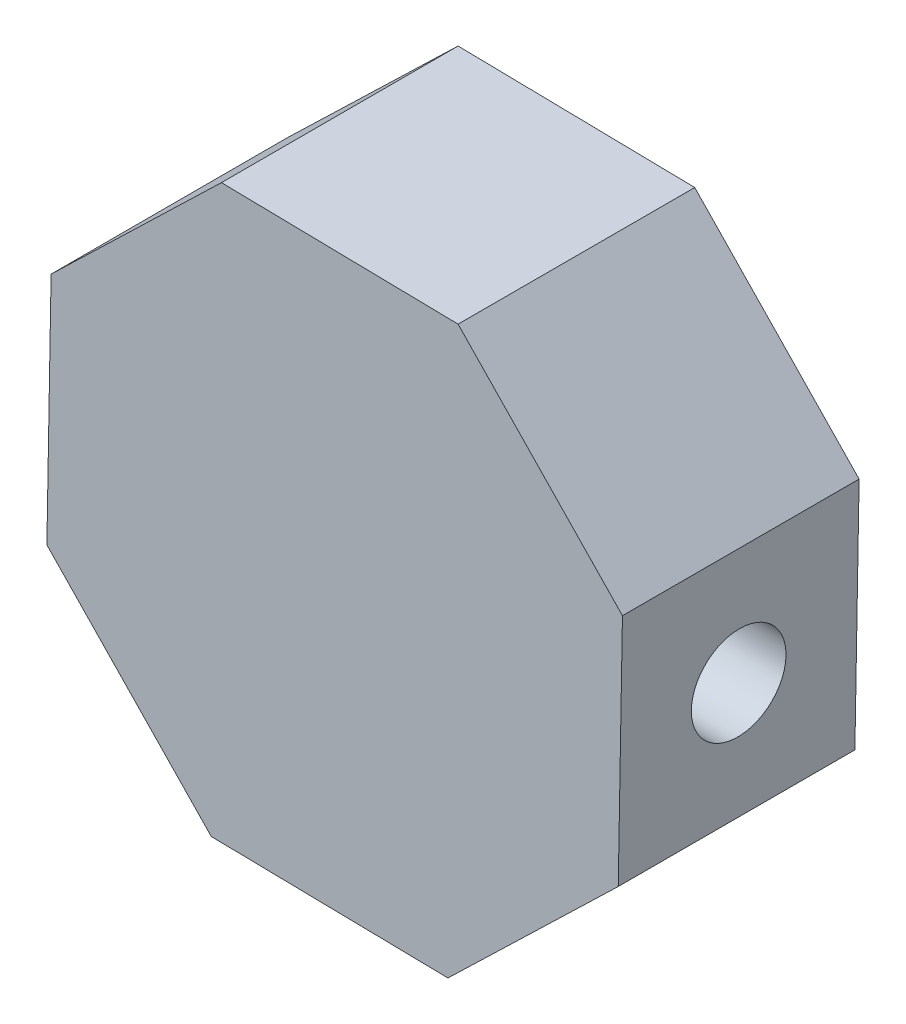
ISO-10303-21;
HEADER;
FILE_DESCRIPTION(('STEP AP214'),'2;1');
FILE_NAME('part.step','',(''),(''),'','','');
FILE_SCHEMA(('AUTOMOTIVE_DESIGN { 1 0 10303 214 1 1 1 1 }'));
ENDSEC;
DATA;
#1=APPLICATION_CONTEXT('core data for automotive mechanical design processes');
#2=APPLICATION_PROTOCOL_DEFINITION('international standard','automotive_design',2000,#1);
#3=PRODUCT_CONTEXT('',#1,'mechanical');
#4=PRODUCT('Part','Part','',(#3));
#5=PRODUCT_RELATED_PRODUCT_CATEGORY('part','',(#4));
#6=PRODUCT_DEFINITION_FORMATION('','',#4);
#7=PRODUCT_DEFINITION_CONTEXT('part definition',#1,'design');
#8=PRODUCT_DEFINITION('design','',#6,#7);
#9=PRODUCT_DEFINITION_SHAPE('','',#8);
#10=(LENGTH_UNIT() NAMED_UNIT(*) SI_UNIT(.MILLI.,.METRE.));
#11=(NAMED_UNIT(*) PLANE_ANGLE_UNIT() SI_UNIT($,.RADIAN.));
#12=(NAMED_UNIT(*) SI_UNIT($,.STERADIAN.) SOLID_ANGLE_UNIT());
#13=UNCERTAINTY_MEASURE_WITH_UNIT(LENGTH_MEASURE(1.E-05),#10,'distance_accuracy_value','');
#14=(GEOMETRIC_REPRESENTATION_CONTEXT(3) GLOBAL_UNCERTAINTY_ASSIGNED_CONTEXT((#13)) GLOBAL_UNIT_ASSIGNED_CONTEXT((#10,
#11,#12)) REPRESENTATION_CONTEXT('',''));
#15=CARTESIAN_POINT('',(0.,0.,0.));
#16=DIRECTION('',(0.,0.,1.));
#17=DIRECTION('',(1.,0.,0.));
#18=AXIS2_PLACEMENT_3D('',#15,#16,#17);
#19=CARTESIAN_POINT('',(8.17628833843381,-15.8353753850485,12.7));
#20=DIRECTION('',(-0.694405978301021,0.719583447071847,0.));
#21=DIRECTION('',(-0.719583447071847,-0.694405978301021,0.));
#22=AXIS2_PLACEMENT_3D('',#19,#20,#21);
#23=PLANE('',#22);
#24=DIRECTION('',(0.719583447071847,0.694405978301021,0.));
#25=VECTOR('',#24,1.);
#26=CARTESIAN_POINT('',(8.17628833843381,-15.8353753850485,0.));
#27=LINE('',#26,#25);
#28=CARTESIAN_POINT('',(8.17628833843381,-15.8353753850485,0.));
#29=VERTEX_POINT('',#28);
#30=CARTESIAN_POINT('',(17.3164467289154,-7.01502153339178,0.));
#31=VERTEX_POINT('',#30);
#32=EDGE_CURVE('E140',#29,#31,#27,.T.);
#33=ORIENTED_EDGE('',*,*,#32,.T.);
#34=DIRECTION('',(0.,0.,-1.));
#35=VECTOR('',#34,1.);
#36=CARTESIAN_POINT('',(17.3164467289154,-7.01502153339178,12.7));
#37=LINE('',#36,#35);
#38=CARTESIAN_POINT('',(17.3164467289154,-7.01502153339178,12.7));
#39=VERTEX_POINT('',#38);
#40=EDGE_CURVE('E11',#39,#31,#37,.T.);
#41=ORIENTED_EDGE('',*,*,#40,.F.);
#42=DIRECTION('',(0.719583447071847,0.694405978301021,0.));
#43=VECTOR('',#42,1.);
#44=CARTESIAN_POINT('',(8.17628833843381,-15.8353753850485,12.7));
#45=LINE('',#44,#43);
#46=CARTESIAN_POINT('',(8.17628833843381,-15.8353753850485,12.7));
#47=VERTEX_POINT('',#46);
#48=EDGE_CURVE('E163',#47,#39,#45,.T.);
#49=ORIENTED_EDGE('',*,*,#48,.F.);
#50=DIRECTION('',(0.,0.,-1.));
#51=VECTOR('',#50,1.);
#52=CARTESIAN_POINT('',(8.17628833843381,-15.8353753850485,12.7));
#53=LINE('',#52,#51);
#54=EDGE_CURVE('E136',#47,#29,#53,.T.);
#55=ORIENTED_EDGE('',*,*,#54,.T.);
#56=EDGE_LOOP('',(#33,#41,#49,#55));
#57=FACE_BOUND('',#56,.T.);
#58=ADVANCED_FACE('F39',(#57),#23,.F.);
#59=CARTESIAN_POINT('',(17.3164467289154,-7.01502153339178,12.7));
#60=DIRECTION('',(-0.999841511207225,0.0178031589009636,0.));
#61=DIRECTION('',(-0.0178031589009636,-0.999841511207225,0.));
#62=AXIS2_PLACEMENT_3D('',#59,#60,#61);
#63=PLANE('',#62);
#64=CARTESIAN_POINT('',(17.429514707944,-0.665021533391774,6.35));
#65=DIRECTION('',(0.999841511207225,-0.0178031589009636,0.));
#66=DIRECTION('',(0.0178031589009636,0.999841511207225,0.));
#67=AXIS2_PLACEMENT_3D('',#64,#65,#66);
#68=CIRCLE('',#67,2.54);
#69=CARTESIAN_POINT('',(17.4747347315524,1.87457590507458,6.35));
#70=VERTEX_POINT('',#69);
#71=EDGE_CURVE('E207',#70,#70,#68,.T.);
#72=ORIENTED_EDGE('',*,*,#71,.F.);
#73=EDGE_LOOP('',(#72));
#74=FACE_BOUND('',#73,.T.);
#75=DIRECTION('',(0.0178031589009636,0.999841511207225,0.));
#76=VECTOR('',#75,1.);
#77=CARTESIAN_POINT('',(17.3164467289154,-7.01502153339178,0.));
#78=LINE('',#77,#76);
#79=CARTESIAN_POINT('',(17.5425826869726,5.68497846660823,0.));
#80=VERTEX_POINT('',#79);
#81=EDGE_CURVE('E144',#31,#80,#78,.T.);
#82=ORIENTED_EDGE('',*,*,#81,.T.);
#83=DIRECTION('',(0.,0.,-1.));
#84=VECTOR('',#83,1.);
#85=CARTESIAN_POINT('',(17.5425826869726,5.68497846660823,12.7));
#86=LINE('',#85,#84);
#87=CARTESIAN_POINT('',(17.5425826869726,5.68497846660823,12.7));
#88=VERTEX_POINT('',#87);
#89=EDGE_CURVE('E48',#88,#80,#86,.T.);
#90=ORIENTED_EDGE('',*,*,#89,.F.);
#91=DIRECTION('',(0.0178031589009636,0.999841511207225,0.));
#92=VECTOR('',#91,1.);
#93=CARTESIAN_POINT('',(17.3164467289154,-7.01502153339178,12.7));
#94=LINE('',#93,#92);
#95=EDGE_CURVE('E99',#39,#88,#94,.T.);
#96=ORIENTED_EDGE('',*,*,#95,.F.);
#97=ORIENTED_EDGE('',*,*,#40,.T.);
#98=EDGE_LOOP('',(#82,#90,#96,#97));
#99=FACE_BOUND('',#98,.T.);
#100=ADVANCED_FACE('F245',(#74,#99),#63,.F.);
#101=CARTESIAN_POINT('',(17.5425826869726,5.68497846660823,12.7));
#102=DIRECTION('',(-0.719583447071847,-0.694405978301021,0.));
#103=DIRECTION('',(0.694405978301021,-0.719583447071847,0.));
#104=AXIS2_PLACEMENT_3D('',#101,#102,#103);
#105=PLANE('',#104);
#106=DIRECTION('',(-0.694405978301021,0.719583447071847,0.));
#107=VECTOR('',#106,1.);
#108=CARTESIAN_POINT('',(17.5425826869726,5.68497846660823,0.));
#109=LINE('',#108,#107);
#110=CARTESIAN_POINT('',(8.72222883531583,14.8251368570898,0.));
#111=VERTEX_POINT('',#110);
#112=EDGE_CURVE('E148',#80,#111,#109,.T.);
#113=ORIENTED_EDGE('',*,*,#112,.T.);
#114=DIRECTION('',(0.,0.,-1.));
#115=VECTOR('',#114,1.);
#116=CARTESIAN_POINT('',(8.72222883531583,14.8251368570898,12.7));
#117=LINE('',#116,#115);
#118=CARTESIAN_POINT('',(8.72222883531583,14.8251368570898,12.7));
#119=VERTEX_POINT('',#118);
#120=EDGE_CURVE('E174',#119,#111,#117,.T.);
#121=ORIENTED_EDGE('',*,*,#120,.F.);
#122=DIRECTION('',(-0.694405978301021,0.719583447071847,0.));
#123=VECTOR('',#122,1.);
#124=CARTESIAN_POINT('',(17.5425826869726,5.68497846660823,12.7));
#125=LINE('',#124,#123);
#126=EDGE_CURVE('E184',#88,#119,#125,.T.);
#127=ORIENTED_EDGE('',*,*,#126,.F.);
#128=ORIENTED_EDGE('',*,*,#89,.T.);
#129=EDGE_LOOP('',(#113,#121,#127,#128));
#130=FACE_BOUND('',#129,.T.);
#131=ADVANCED_FACE('F182',(#130),#105,.F.);
#132=CARTESIAN_POINT('',(8.72222883531583,14.8251368570898,12.7));
#133=DIRECTION('',(-0.0178031589009636,-0.999841511207225,0.));
#134=DIRECTION('',(0.999841511207225,-0.0178031589009636,0.));
#135=AXIS2_PLACEMENT_3D('',#132,#133,#134);
#136=PLANE('',#135);
#137=DIRECTION('',(-0.999841511207225,0.0178031589009636,0.));
#138=VECTOR('',#137,1.);
#139=CARTESIAN_POINT('',(8.72222883531583,14.8251368570898,0.));
#140=LINE('',#139,#138);
#141=CARTESIAN_POINT('',(-3.97777116468418,15.051272815147,0.));
#142=VERTEX_POINT('',#141);
#143=EDGE_CURVE('E151',#111,#142,#140,.T.);
#144=ORIENTED_EDGE('',*,*,#143,.T.);
#145=DIRECTION('',(0.,0.,-1.));
#146=VECTOR('',#145,1.);
#147=CARTESIAN_POINT('',(-3.97777116468418,15.051272815147,12.7));
#148=LINE('',#147,#146);
#149=CARTESIAN_POINT('',(-3.97777116468418,15.051272815147,12.7));
#150=VERTEX_POINT('',#149);
#151=EDGE_CURVE('E170',#150,#142,#148,.T.);
#152=ORIENTED_EDGE('',*,*,#151,.F.);
#153=DIRECTION('',(-0.999841511207225,0.0178031589009636,0.));
#154=VECTOR('',#153,1.);
#155=CARTESIAN_POINT('',(8.72222883531583,14.8251368570898,12.7));
#156=LINE('',#155,#154);
#157=EDGE_CURVE('E197',#119,#150,#156,.T.);
#158=ORIENTED_EDGE('',*,*,#157,.F.);
#159=ORIENTED_EDGE('',*,*,#120,.T.);
#160=EDGE_LOOP('',(#144,#152,#158,#159));
#161=FACE_BOUND('',#160,.T.);
#162=ADVANCED_FACE('F192',(#161),#136,.F.);
#163=CARTESIAN_POINT('',(-3.97777116468418,15.051272815147,12.7));
#164=DIRECTION('',(0.694405978301021,-0.719583447071847,0.));
#165=DIRECTION('',(0.719583447071847,0.694405978301021,0.));
#166=AXIS2_PLACEMENT_3D('',#163,#164,#165);
#167=PLANE('',#166);
#168=DIRECTION('',(-0.719583447071847,-0.694405978301021,0.));
#169=VECTOR('',#168,1.);
#170=CARTESIAN_POINT('',(-3.97777116468418,15.051272815147,0.));
#171=LINE('',#170,#169);
#172=CARTESIAN_POINT('',(-13.1179295551657,6.23091896349023,0.));
#173=VERTEX_POINT('',#172);
#174=EDGE_CURVE('E154',#142,#173,#171,.T.);
#175=ORIENTED_EDGE('',*,*,#174,.T.);
#176=DIRECTION('',(0.,0.,-1.));
#177=VECTOR('',#176,1.);
#178=CARTESIAN_POINT('',(-13.1179295551657,6.23091896349023,12.7));
#179=LINE('',#178,#177);
#180=CARTESIAN_POINT('',(-13.1179295551657,6.23091896349023,12.7));
#181=VERTEX_POINT('',#180);
#182=EDGE_CURVE('E129',#181,#173,#179,.T.);
#183=ORIENTED_EDGE('',*,*,#182,.F.);
#184=DIRECTION('',(-0.719583447071847,-0.694405978301021,0.));
#185=VECTOR('',#184,1.);
#186=CARTESIAN_POINT('',(-3.97777116468418,15.051272815147,12.7));
#187=LINE('',#186,#185);
#188=EDGE_CURVE('E118',#150,#181,#187,.T.);
#189=ORIENTED_EDGE('',*,*,#188,.F.);
#190=ORIENTED_EDGE('',*,*,#151,.T.);
#191=EDGE_LOOP('',(#175,#183,#189,#190));
#192=FACE_BOUND('',#191,.T.);
#193=ADVANCED_FACE('F195',(#192),#167,.F.);
#194=CARTESIAN_POINT('',(-13.1179295551657,6.23091896349023,12.7));
#195=DIRECTION('',(0.999841511207225,-0.0178031589009637,0.));
#196=DIRECTION('',(0.0178031589009637,0.999841511207225,0.));
#197=AXIS2_PLACEMENT_3D('',#194,#195,#196);
#198=PLANE('',#197);
#199=DIRECTION('',(-0.0178031589009637,-0.999841511207225,0.));
#200=VECTOR('',#199,1.);
#201=CARTESIAN_POINT('',(-13.1179295551657,6.23091896349023,0.));
#202=LINE('',#201,#200);
#203=CARTESIAN_POINT('',(-13.3440655132229,-6.46908103650977,0.));
#204=VERTEX_POINT('',#203);
#205=EDGE_CURVE('E127',#173,#204,#202,.T.);
#206=ORIENTED_EDGE('',*,*,#205,.T.);
#207=DIRECTION('',(0.,0.,-1.));
#208=VECTOR('',#207,1.);
#209=CARTESIAN_POINT('',(-13.3440655132229,-6.46908103650977,12.7));
#210=LINE('',#209,#208);
#211=CARTESIAN_POINT('',(-13.3440655132229,-6.46908103650977,12.7));
#212=VERTEX_POINT('',#211);
#213=EDGE_CURVE('E124',#212,#204,#210,.T.);
#214=ORIENTED_EDGE('',*,*,#213,.F.);
#215=DIRECTION('',(-0.0178031589009637,-0.999841511207225,0.));
#216=VECTOR('',#215,1.);
#217=CARTESIAN_POINT('',(-13.1179295551657,6.23091896349023,12.7));
#218=LINE('',#217,#216);
#219=EDGE_CURVE('E112',#181,#212,#218,.T.);
#220=ORIENTED_EDGE('',*,*,#219,.F.);
#221=ORIENTED_EDGE('',*,*,#182,.T.);
#222=EDGE_LOOP('',(#206,#214,#220,#221));
#223=FACE_BOUND('',#222,.T.);
#224=ADVANCED_FACE('F125',(#223),#198,.F.);
#225=CARTESIAN_POINT('',(-13.3440655132229,-6.46908103650977,12.7));
#226=DIRECTION('',(0.719583447071847,0.694405978301021,0.));
#227=DIRECTION('',(-0.694405978301021,0.719583447071847,0.));
#228=AXIS2_PLACEMENT_3D('',#225,#226,#227);
#229=PLANE('',#228);
#230=DIRECTION('',(0.694405978301021,-0.719583447071847,0.));
#231=VECTOR('',#230,1.);
#232=CARTESIAN_POINT('',(-13.3440655132229,-6.46908103650977,0.));
#233=LINE('',#232,#231);
#234=CARTESIAN_POINT('',(-4.52371166156618,-15.6092394269913,0.));
#235=VERTEX_POINT('',#234);
#236=EDGE_CURVE('E85',#204,#235,#233,.T.);
#237=ORIENTED_EDGE('',*,*,#236,.T.);
#238=DIRECTION('',(0.,0.,-1.));
#239=VECTOR('',#238,1.);
#240=CARTESIAN_POINT('',(-4.52371166156618,-15.6092394269913,12.7));
#241=LINE('',#240,#239);
#242=CARTESIAN_POINT('',(-4.52371166156618,-15.6092394269913,12.7));
#243=VERTEX_POINT('',#242);
#244=EDGE_CURVE('E130',#243,#235,#241,.T.);
#245=ORIENTED_EDGE('',*,*,#244,.F.);
#246=DIRECTION('',(0.694405978301021,-0.719583447071847,0.));
#247=VECTOR('',#246,1.);
#248=CARTESIAN_POINT('',(-13.3440655132229,-6.46908103650977,12.7));
#249=LINE('',#248,#247);
#250=EDGE_CURVE('E116',#212,#243,#249,.T.);
#251=ORIENTED_EDGE('',*,*,#250,.F.);
#252=ORIENTED_EDGE('',*,*,#213,.T.);
#253=EDGE_LOOP('',(#237,#245,#251,#252));
#254=FACE_BOUND('',#253,.T.);
#255=ADVANCED_FACE('F132',(#254),#229,.F.);
#256=CARTESIAN_POINT('',(-4.52371166156618,-15.6092394269913,12.7));
#257=DIRECTION('',(0.0178031589009639,0.999841511207225,0.));
#258=DIRECTION('',(-0.999841511207225,0.0178031589009639,0.));
#259=AXIS2_PLACEMENT_3D('',#256,#257,#258);
#260=PLANE('',#259);
#261=DIRECTION('',(0.999841511207225,-0.0178031589009639,0.));
#262=VECTOR('',#261,1.);
#263=CARTESIAN_POINT('',(-4.52371166156618,-15.6092394269913,0.));
#264=LINE('',#263,#262);
#265=EDGE_CURVE('E91',#235,#29,#264,.T.);
#266=ORIENTED_EDGE('',*,*,#265,.T.);
#267=ORIENTED_EDGE('',*,*,#54,.F.);
#268=DIRECTION('',(0.999841511207225,-0.0178031589009639,0.));
#269=VECTOR('',#268,1.);
#270=CARTESIAN_POINT('',(-4.52371166156618,-15.6092394269913,12.7));
#271=LINE('',#270,#269);
#272=EDGE_CURVE('E56',#243,#47,#271,.T.);
#273=ORIENTED_EDGE('',*,*,#272,.F.);
#274=ORIENTED_EDGE('',*,*,#244,.T.);
#275=EDGE_LOOP('',(#266,#267,#273,#274));
#276=FACE_BOUND('',#275,.T.);
#277=ADVANCED_FACE('F241',(#276),#260,.F.);
#278=CARTESIAN_POINT('',(0.,0.,12.7));
#279=DIRECTION('',(0.,0.,1.));
#280=DIRECTION('',(1.,0.,0.));
#281=AXIS2_PLACEMENT_3D('',#278,#279,#280);
#282=PLANE('',#281);
#283=ORIENTED_EDGE('',*,*,#48,.T.);
#284=ORIENTED_EDGE('',*,*,#95,.T.);
#285=ORIENTED_EDGE('',*,*,#126,.T.);
#286=ORIENTED_EDGE('',*,*,#157,.T.);
#287=ORIENTED_EDGE('',*,*,#188,.T.);
#288=ORIENTED_EDGE('',*,*,#219,.T.);
#289=ORIENTED_EDGE('',*,*,#250,.T.);
#290=ORIENTED_EDGE('',*,*,#272,.T.);
#291=EDGE_LOOP('',(#283,#284,#285,#286,#287,#288,#289,#290));
#292=FACE_BOUND('',#291,.T.);
#293=ADVANCED_FACE('F114',(#292),#282,.T.);
#294=CARTESIAN_POINT('',(0.,0.,0.));
#295=DIRECTION('',(0.,0.,1.));
#296=DIRECTION('',(1.,0.,0.));
#297=AXIS2_PLACEMENT_3D('',#294,#295,#296);
#298=PLANE('',#297);
#299=CARTESIAN_POINT('',(2.09925858687482,-0.392051284950772,0.));
#300=DIRECTION('',(0.,0.,-1.));
#301=DIRECTION('',(-1.,0.,0.));
#302=AXIS2_PLACEMENT_3D('',#299,#300,#301);
#303=CIRCLE('',#302,3.175);
#304=CARTESIAN_POINT('',(-1.07574141312518,-0.392051284950772,0.));
#305=VERTEX_POINT('',#304);
#306=EDGE_CURVE('E215',#305,#305,#303,.T.);
#307=ORIENTED_EDGE('',*,*,#306,.F.);
#308=EDGE_LOOP('',(#307));
#309=FACE_BOUND('',#308,.T.);
#310=ORIENTED_EDGE('',*,*,#32,.F.);
#311=ORIENTED_EDGE('',*,*,#265,.F.);
#312=ORIENTED_EDGE('',*,*,#236,.F.);
#313=ORIENTED_EDGE('',*,*,#205,.F.);
#314=ORIENTED_EDGE('',*,*,#174,.F.);
#315=ORIENTED_EDGE('',*,*,#143,.F.);
#316=ORIENTED_EDGE('',*,*,#112,.F.);
#317=ORIENTED_EDGE('',*,*,#81,.F.);
#318=EDGE_LOOP('',(#310,#311,#312,#313,#314,#315,#316,#317));
#319=FACE_BOUND('',#318,.T.);
#320=ADVANCED_FACE('F188',(#309,#319),#298,.F.);
#321=CARTESIAN_POINT('',(4.73152751561221,-0.438921415349536,6.35));
#322=DIRECTION('',(0.999841511207225,-0.0178031589009636,0.));
#323=DIRECTION('',(0.0178031589009636,0.999841511207225,0.));
#324=AXIS2_PLACEMENT_3D('',#321,#322,#323);
#325=CYLINDRICAL_SURFACE('',#324,2.54);
#326=CARTESIAN_POINT('',(4.73152751561221,-0.438921415349536,6.35));
#327=DIRECTION('',(0.999841511207225,-0.0178031589009636,0.));
#328=DIRECTION('',(0.0178031589009636,0.999841511207225,0.));
#329=AXIS2_PLACEMENT_3D('',#326,#327,#328);
#330=CIRCLE('',#329,2.54);
#331=CARTESIAN_POINT('',(4.77674753922065,2.10067602311681,6.35));
#332=VERTEX_POINT('',#331);
#333=EDGE_CURVE('E145',#332,#332,#330,.T.);
#334=CARTESIAN_POINT('',(4.77674753922065,2.10067602311681,6.35));
#335=CARTESIAN_POINT('',(4.90901823914078,2.09832081355387,6.35));
#336=CARTESIAN_POINT('',(5.0412889390609,2.09596560399093,6.35));
#337=CARTESIAN_POINT('',(5.30583033890114,2.09125518486505,6.35));
#338=CARTESIAN_POINT('',(5.43810103882127,2.08889997530211,6.35));
#339=CARTESIAN_POINT('',(5.70264243866151,2.08418955617624,6.35));
#340=CARTESIAN_POINT('',(5.83491313858163,2.0818343466133,6.35));
#341=CARTESIAN_POINT('',(6.09945453842188,2.07712392748741,6.35));
#342=CARTESIAN_POINT('',(6.231725238342,2.07476871792447,6.35));
#343=CARTESIAN_POINT('',(6.49626663818224,2.07005829879859,6.35));
#344=CARTESIAN_POINT('',(6.62853733810237,2.06770308923565,6.35));
#345=CARTESIAN_POINT('',(6.89307873794261,2.06299267010978,6.35));
#346=CARTESIAN_POINT('',(7.02534943786273,2.06063746054683,6.35));
#347=CARTESIAN_POINT('',(7.28989083770298,2.05592704142096,6.35));
#348=CARTESIAN_POINT('',(7.4221615376231,2.05357183185801,6.35));
#349=CARTESIAN_POINT('',(7.68670293746335,2.04886141273214,6.35));
#350=CARTESIAN_POINT('',(7.81897363738347,2.0465062031692,6.35));
#351=CARTESIAN_POINT('',(8.08351503722371,2.04179578404332,6.35));
#352=CARTESIAN_POINT('',(8.21578573714384,2.03944057448038,6.35));
#353=CARTESIAN_POINT('',(8.48032713698408,2.0347301553545,6.35));
#354=CARTESIAN_POINT('',(8.61259783690421,2.03237494579156,6.35));
#355=CARTESIAN_POINT('',(8.87713923674445,2.02766452666568,6.35));
#356=CARTESIAN_POINT('',(9.00940993666457,2.02530931710274,6.35));
#357=CARTESIAN_POINT('',(9.27395133650482,2.02059889797685,6.35));
#358=CARTESIAN_POINT('',(9.40622203642494,2.01824368841392,6.35));
#359=CARTESIAN_POINT('',(9.67076343626519,2.01353326928804,6.35));
#360=CARTESIAN_POINT('',(9.80303413618531,2.0111780597251,6.35));
#361=CARTESIAN_POINT('',(10.0675755360256,2.00646764059922,6.35));
#362=CARTESIAN_POINT('',(10.1998462359457,2.00411243103628,6.35));
#363=CARTESIAN_POINT('',(10.4643876357859,1.9994020119104,6.35));
#364=CARTESIAN_POINT('',(10.596658335706,1.99704680234746,6.35));
#365=CARTESIAN_POINT('',(10.8611997355463,1.99233638322158,6.35));
#366=CARTESIAN_POINT('',(10.9934704354664,1.98998117365864,6.35));
#367=CARTESIAN_POINT('',(11.2580118353067,1.98527075453276,6.35));
#368=CARTESIAN_POINT('',(11.3902825352268,1.98291554496982,6.35));
#369=CARTESIAN_POINT('',(11.654823935067,1.97820512584394,6.35));
#370=CARTESIAN_POINT('',(11.7870946349871,1.975849916281,6.35));
#371=CARTESIAN_POINT('',(12.0516360348274,1.97113949715512,6.35));
#372=CARTESIAN_POINT('',(12.1839067347475,1.96878428759218,6.35));
#373=CARTESIAN_POINT('',(12.4484481345878,1.9640738684663,6.35));
#374=CARTESIAN_POINT('',(12.5807188345079,1.96171865890336,6.35));
#375=CARTESIAN_POINT('',(12.8452602343481,1.95700823977748,6.35));
#376=CARTESIAN_POINT('',(12.9775309342682,1.95465303021454,6.35));
#377=CARTESIAN_POINT('',(13.2420723341085,1.94994261108866,6.35));
#378=CARTESIAN_POINT('',(13.3743430340286,1.94758740152572,6.35));
#379=CARTESIAN_POINT('',(13.6388844338689,1.94287698239984,6.35));
#380=CARTESIAN_POINT('',(13.771155133789,1.9405217728369,6.35));
#381=CARTESIAN_POINT('',(14.0356965336292,1.93581135371102,6.35));
#382=CARTESIAN_POINT('',(14.1679672335493,1.93345614414808,6.35));
#383=CARTESIAN_POINT('',(14.4325086333896,1.9287457250222,6.35));
#384=CARTESIAN_POINT('',(14.5647793333097,1.92639051545926,6.35));
#385=CARTESIAN_POINT('',(14.82932073315,1.92168009633338,6.35));
#386=CARTESIAN_POINT('',(14.9615914330701,1.91932488677044,6.35));
#387=CARTESIAN_POINT('',(15.2261328329103,1.91461446764456,6.35));
#388=CARTESIAN_POINT('',(15.3584035328305,1.91225925808162,6.35));
#389=CARTESIAN_POINT('',(15.6229449326707,1.90754883895574,6.35));
#390=CARTESIAN_POINT('',(15.7552156325908,1.9051936293928,6.35));
#391=CARTESIAN_POINT('',(16.0197570324311,1.90048321026692,6.35));
#392=CARTESIAN_POINT('',(16.1520277323512,1.89812800070398,6.35));
#393=CARTESIAN_POINT('',(16.4165691321914,1.8934175815781,6.35));
#394=CARTESIAN_POINT('',(16.5488398321116,1.89106237201516,6.35));
#395=CARTESIAN_POINT('',(16.8133812319518,1.88635195288928,6.35));
#396=CARTESIAN_POINT('',(16.9456519318719,1.88399674332634,6.35));
#397=CARTESIAN_POINT('',(17.2101933317122,1.87928632420046,6.35));
#398=CARTESIAN_POINT('',(17.3424640316323,1.87693111463752,6.35));
#399=CARTESIAN_POINT('',(17.4747347315524,1.87457590507458,6.35));
#400=B_SPLINE_CURVE_WITH_KNOTS('',3,(#334,#335,#336,#337,#338,#339,#340,#341,#342,#343,#344,
#345,#346,#347,#348,#349,#350,#351,#352,#353,#354,#355,#356,#357,#358,#359,#360,#361,#362,#363,
#364,#365,#366,#367,#368,#369,#370,#371,#372,#373,#374,#375,#376,#377,#378,#379,#380,#381,#382,
#383,#384,#385,#386,#387,#388,#389,#390,#391,#392,#393,#394,#395,#396,#397,#398,#399),
.UNSPECIFIED.,.F.,.F.,(4,2,2,2,2,2,2,2,2,2,2,2,2,2,2,2,2,2,2,2,2,2,2,2,2,2,2,2,2,2,2,2,4),(0.,
0.396875,0.79375,1.190625,1.5875,1.984375,2.38125,2.778125,3.175,3.571875,3.96875,4.365625,
4.7625,5.159375,5.55625,5.953125,6.35,6.746875,7.14375,7.540625,7.9375,8.334375,8.73125,
9.128125,9.525,9.921875,10.31875,10.715625,11.1125,11.509375,11.90625,12.303125,12.7),.UNSPECIFIED.);
#401=EDGE_CURVE('BSEAM233',#332,#70,#400,.T.);
#402=ORIENTED_EDGE('',*,*,#333,.F.);
#403=ORIENTED_EDGE('',*,*,#71,.T.);
#404=ORIENTED_EDGE('',*,*,#401,.T.);
#405=ORIENTED_EDGE('',*,*,#401,.F.);
#406=EDGE_LOOP('',(#402,#404,#403,#405));
#407=FACE_BOUND('',#406,.T.);
#408=ADVANCED_FACE('F233',(#407),#325,.F.);
#409=CARTESIAN_POINT('',(4.73784079553548,-0.0843619029465404,0.));
#410=DIRECTION('',(0.999841511207225,-0.0178031589009636,0.));
#411=DIRECTION('',(0.0178031589009636,0.999841511207225,0.));
#412=AXIS2_PLACEMENT_3D('',#409,#410,#411);
#413=PLANE('',#412);
#414=ORIENTED_EDGE('',*,*,#333,.T.);
#415=EDGE_LOOP('',(#414));
#416=FACE_BOUND('',#415,.T.);
#417=ADVANCED_FACE('F228',(#416),#413,.T.);
#418=CARTESIAN_POINT('',(2.09925858687482,-0.392051284950772,2.54));
#419=DIRECTION('',(0.,0.,-1.));
#420=DIRECTION('',(-1.,0.,0.));
#421=AXIS2_PLACEMENT_3D('',#418,#419,#420);
#422=CYLINDRICAL_SURFACE('',#421,3.175);
#423=CARTESIAN_POINT('',(2.09925858687482,-0.392051284950772,2.54));
#424=DIRECTION('',(0.,0.,-1.));
#425=DIRECTION('',(-1.,0.,0.));
#426=AXIS2_PLACEMENT_3D('',#423,#424,#425);
#427=CIRCLE('',#426,3.175);
#428=CARTESIAN_POINT('',(-1.07574141312518,-0.392051284950772,2.54));
#429=VERTEX_POINT('',#428);
#430=EDGE_CURVE('E211',#429,#429,#427,.T.);
#431=ORIENTED_EDGE('',*,*,#430,.F.);
#432=EDGE_LOOP('',(#431));
#433=FACE_BOUND('',#432,.T.);
#434=ORIENTED_EDGE('',*,*,#306,.T.);
#435=EDGE_LOOP('',(#434));
#436=FACE_BOUND('',#435,.T.);
#437=ADVANCED_FACE('F225',(#433,#436),#422,.F.);
#438=CARTESIAN_POINT('',(0.,0.,2.54));
#439=DIRECTION('',(0.,0.,-1.));
#440=DIRECTION('',(-1.,0.,0.));
#441=AXIS2_PLACEMENT_3D('',#438,#439,#440);
#442=PLANE('',#441);
#443=ORIENTED_EDGE('',*,*,#430,.T.);
#444=EDGE_LOOP('',(#443));
#445=FACE_BOUND('',#444,.T.);
#446=ADVANCED_FACE('F223',(#445),#442,.T.);
#447=CLOSED_SHELL('',(#58,#100,#131,#162,#193,#224,#255,#277,#293,#320,#408,#417,#437,#446));
#448=MANIFOLD_SOLID_BREP('B2',#447);
#449=ADVANCED_BREP_SHAPE_REPRESENTATION('',(#18,#448),#14);
#450=SHAPE_DEFINITION_REPRESENTATION(#9,#449);
ENDSEC;
END-ISO-10303-21;
